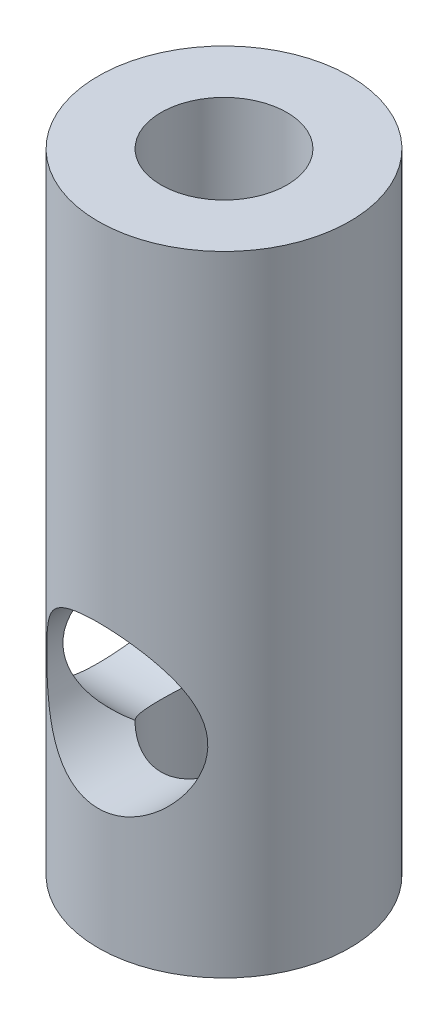
ISO-10303-21;
HEADER;
FILE_DESCRIPTION(('STEP AP214'),'2;1');
FILE_NAME('part.step','',(''),(''),'','','');
FILE_SCHEMA(('AUTOMOTIVE_DESIGN { 1 0 10303 214 1 1 1 1 }'));
ENDSEC;
DATA;
#1=APPLICATION_CONTEXT('core data for automotive mechanical design processes');
#2=APPLICATION_PROTOCOL_DEFINITION('international standard','automotive_design',2000,#1);
#3=PRODUCT_CONTEXT('',#1,'mechanical');
#4=PRODUCT('Part','Part','',(#3));
#5=PRODUCT_RELATED_PRODUCT_CATEGORY('part','',(#4));
#6=PRODUCT_DEFINITION_FORMATION('','',#4);
#7=PRODUCT_DEFINITION_CONTEXT('part definition',#1,'design');
#8=PRODUCT_DEFINITION('design','',#6,#7);
#9=PRODUCT_DEFINITION_SHAPE('','',#8);
#10=(LENGTH_UNIT() NAMED_UNIT(*) SI_UNIT(.MILLI.,.METRE.));
#11=(NAMED_UNIT(*) PLANE_ANGLE_UNIT() SI_UNIT($,.RADIAN.));
#12=(NAMED_UNIT(*) SI_UNIT($,.STERADIAN.) SOLID_ANGLE_UNIT());
#13=UNCERTAINTY_MEASURE_WITH_UNIT(LENGTH_MEASURE(1.E-05),#10,'distance_accuracy_value','');
#14=(GEOMETRIC_REPRESENTATION_CONTEXT(3) GLOBAL_UNCERTAINTY_ASSIGNED_CONTEXT((#13)) GLOBAL_UNIT_ASSIGNED_CONTEXT((#10,
#11,#12)) REPRESENTATION_CONTEXT('',''));
#15=CARTESIAN_POINT('',(0.,0.,0.));
#16=DIRECTION('',(0.,0.,1.));
#17=DIRECTION('',(1.,0.,0.));
#18=AXIS2_PLACEMENT_3D('',#15,#16,#17);
#19=CARTESIAN_POINT('',(0.,15.875,0.));
#20=DIRECTION('',(0.,1.,0.));
#21=DIRECTION('',(0.,0.,1.));
#22=AXIS2_PLACEMENT_3D('',#19,#20,#21);
#23=PLANE('',#22);
#24=CARTESIAN_POINT('',(0.,15.875,0.));
#25=DIRECTION('',(0.,1.,0.));
#26=DIRECTION('',(0.,0.,1.));
#27=AXIS2_PLACEMENT_3D('',#24,#25,#26);
#28=CIRCLE('',#27,3.175);
#29=CARTESIAN_POINT('',(0.,15.875,3.175));
#30=VERTEX_POINT('',#29);
#31=EDGE_CURVE('E130',#30,#30,#28,.T.);
#32=ORIENTED_EDGE('',*,*,#31,.T.);
#33=EDGE_LOOP('',(#32));
#34=FACE_BOUND('',#33,.T.);
#35=CARTESIAN_POINT('',(0.,15.875,0.));
#36=DIRECTION('',(0.,1.,0.));
#37=DIRECTION('',(0.,0.,1.));
#38=AXIS2_PLACEMENT_3D('',#35,#36,#37);
#39=CIRCLE('',#38,1.5875);
#40=CARTESIAN_POINT('',(0.,15.875,1.5875));
#41=VERTEX_POINT('',#40);
#42=EDGE_CURVE('E136',#41,#41,#39,.T.);
#43=ORIENTED_EDGE('',*,*,#42,.F.);
#44=EDGE_LOOP('',(#43));
#45=FACE_BOUND('',#44,.T.);
#46=ADVANCED_FACE('F33',(#34,#45),#23,.T.);
#47=CARTESIAN_POINT('',(0.,0.,0.));
#48=DIRECTION('',(0.,1.,0.));
#49=DIRECTION('',(0.,0.,1.));
#50=AXIS2_PLACEMENT_3D('',#47,#48,#49);
#51=PLANE('',#50);
#52=CARTESIAN_POINT('',(0.,0.,0.));
#53=DIRECTION('',(0.,1.,0.));
#54=DIRECTION('',(0.,0.,1.));
#55=AXIS2_PLACEMENT_3D('',#52,#53,#54);
#56=CIRCLE('',#55,3.175);
#57=CARTESIAN_POINT('',(0.,0.,3.175));
#58=VERTEX_POINT('',#57);
#59=EDGE_CURVE('E132',#58,#58,#56,.T.);
#60=ORIENTED_EDGE('',*,*,#59,.F.);
#61=EDGE_LOOP('',(#60));
#62=FACE_BOUND('',#61,.T.);
#63=CARTESIAN_POINT('',(0.,0.,0.));
#64=DIRECTION('',(0.,1.,0.));
#65=DIRECTION('',(0.,0.,1.));
#66=AXIS2_PLACEMENT_3D('',#63,#64,#65);
#67=CIRCLE('',#66,1.5875);
#68=CARTESIAN_POINT('',(0.,0.,1.5875));
#69=VERTEX_POINT('',#68);
#70=EDGE_CURVE('E138',#69,#69,#67,.T.);
#71=ORIENTED_EDGE('',*,*,#70,.T.);
#72=EDGE_LOOP('',(#71));
#73=FACE_BOUND('',#72,.T.);
#74=ADVANCED_FACE('F150',(#62,#73),#51,.F.);
#75=CARTESIAN_POINT('',(0.,15.875,0.));
#76=DIRECTION('',(0.,-1.,0.));
#77=DIRECTION('',(0.,0.,-1.));
#78=AXIS2_PLACEMENT_3D('',#75,#76,#77);
#79=CYLINDRICAL_SURFACE('',#78,3.175);
#80=CARTESIAN_POINT('',(0.,3.048,3.17500000000001));
#81=CARTESIAN_POINT('',(-0.102802091998536,3.04800863660194,3.17499204317216));
#82=CARTESIAN_POINT('',(-0.205712967083923,3.05585421267752,3.16995556613701));
#83=CARTESIAN_POINT('',(-0.408345945914426,3.08680490395556,3.15028428681525));
#84=CARTESIAN_POINT('',(-0.508062450647387,3.10993542358825,3.13563350529892));
#85=CARTESIAN_POINT('',(-0.700991871551809,3.17007954143306,3.09820061555947));
#86=CARTESIAN_POINT('',(-0.794234443207291,3.20702409197908,3.07545897543814));
#87=CARTESIAN_POINT('',(-0.972850708349801,3.29326197579849,3.02371392471125));
#88=CARTESIAN_POINT('',(-1.05822486510869,3.34255458141424,2.99471088309728));
#89=CARTESIAN_POINT('',(-1.22657617751478,3.45651628498183,2.93000295258297));
#90=CARTESIAN_POINT('',(-1.3087864338533,3.5221131572026,2.89394397085769));
#91=CARTESIAN_POINT('',(-1.46177780864564,3.66466135194346,2.81976531709182));
#92=CARTESIAN_POINT('',(-1.53254282535194,3.74162838446419,2.7816428408765));
#93=CARTESIAN_POINT('',(-1.67097750324059,3.91761552787057,2.70106343805629));
#94=CARTESIAN_POINT('',(-1.73674918752874,4.01821533480986,2.65876858107148));
#95=CARTESIAN_POINT('',(-1.85029508285189,4.23149422021328,2.58104184987293));
#96=CARTESIAN_POINT('',(-1.89810016623101,4.34415214691275,2.5455982543951));
#97=CARTESIAN_POINT('',(-1.96306433169841,4.54753570360518,2.49563815642881));
#98=CARTESIAN_POINT('',(-1.98501258205519,4.63597239510035,2.47805527375042));
#99=CARTESIAN_POINT('',(-2.01688234158148,4.8162613321989,2.45219187814506));
#100=CARTESIAN_POINT('',(-2.02682213142593,4.90810816620397,2.4438972270032));
#101=CARTESIAN_POINT('',(-2.03406844238956,5.09294589348756,2.43787169233308));
#102=CARTESIAN_POINT('',(-2.03133590853695,5.18593944145871,2.44017346588102));
#103=CARTESIAN_POINT('',(-2.01334074881702,5.3698973413432,2.45503753256747));
#104=CARTESIAN_POINT('',(-1.99806778439991,5.46085995533869,2.46760829159313));
#105=CARTESIAN_POINT('',(-1.95654400964381,5.63570188985075,2.50064563775484));
#106=CARTESIAN_POINT('',(-1.93063371932069,5.71971148849693,2.52086589880532));
#107=CARTESIAN_POINT('',(-1.86892073645816,5.88232940711183,2.56695150673926));
#108=CARTESIAN_POINT('',(-1.83311475787165,5.96093592204008,2.5928187282003));
#109=CARTESIAN_POINT('',(-1.74468379478223,6.12668663899968,2.65331736310943));
#110=CARTESIAN_POINT('',(-1.69014547028027,6.21254322496451,2.68867632216135));
#111=CARTESIAN_POINT('',(-1.56927250704523,6.37486083619803,2.76097453557637));
#112=CARTESIAN_POINT('',(-1.50292389187165,6.45131054595402,2.79791562247839));
#113=CARTESIAN_POINT('',(-1.34609593842543,6.60688227372216,2.87709972256473));
#114=CARTESIAN_POINT('',(-1.25342255447501,6.68394982082796,2.91908129280469));
#115=CARTESIAN_POINT('',(-1.05412916945486,6.82139039050818,2.99680453367646));
#116=CARTESIAN_POINT('',(-0.947524248856553,6.88178124815657,3.03255285532205));
#117=CARTESIAN_POINT('',(-0.745027149764204,6.97307479822838,3.08776548970284));
#118=CARTESIAN_POINT('',(-0.65119748908739,7.00744934370647,3.1090528487167));
#119=CARTESIAN_POINT('',(-0.458101923285707,7.06222466387092,3.14330309554202));
#120=CARTESIAN_POINT('',(-0.358840457318056,7.08263667058892,3.15627267398738));
#121=CARTESIAN_POINT('',(-0.157245856062992,7.10846131970164,3.17272053168039));
#122=CARTESIAN_POINT('',(-0.0549035728236089,7.11382366228872,3.1761669816173));
#123=CARTESIAN_POINT('',(0.149278703587838,7.1090803895675,3.17313166741519));
#124=CARTESIAN_POINT('',(0.251118666928858,7.09897386645272,3.16664932059437));
#125=CARTESIAN_POINT('',(0.445777818959483,7.06483170248459,3.14499563248384));
#126=CARTESIAN_POINT('',(0.53878877109895,7.04156495036066,3.13030442711357));
#127=CARTESIAN_POINT('',(0.719347665233581,6.98278346951135,3.09380938215554));
#128=CARTESIAN_POINT('',(0.806894685878689,6.9472666816902,3.07200434684486));
#129=CARTESIAN_POINT('',(0.981221766727702,6.86222429678657,3.02103940447064));
#130=CARTESIAN_POINT('',(1.06746270490707,6.81185465460779,2.99145375338782));
#131=CARTESIAN_POINT('',(1.23068208252938,6.69995479062798,2.92809272901181));
#132=CARTESIAN_POINT('',(1.30765325924851,6.6384159113132,2.89431411212648));
#133=CARTESIAN_POINT('',(1.46249777618802,6.49523243895981,2.81960831865928));
#134=CARTESIAN_POINT('',(1.53871535620922,6.41195269540887,2.77837700931998));
#135=CARTESIAN_POINT('',(1.67667876113209,6.23347215177528,2.69736409760926));
#136=CARTESIAN_POINT('',(1.73842174216537,6.13826901469508,2.65758278141684));
#137=CARTESIAN_POINT('',(1.83860127108378,5.95078432826427,2.58908117678436));
#138=CARTESIAN_POINT('',(1.8790680245676,5.8598752888727,2.5595922960966));
#139=CARTESIAN_POINT('',(1.94668410344128,5.67115232647123,2.50855535607172));
#140=CARTESIAN_POINT('',(1.97385191986361,5.57334820833178,2.48699628145414));
#141=CARTESIAN_POINT('',(2.01355343863444,5.37195108414518,2.45497691549337));
#142=CARTESIAN_POINT('',(2.02594703301666,5.26831226625837,2.44462296914142));
#143=CARTESIAN_POINT('',(2.03456932369406,5.05992252687714,2.43745721220955));
#144=CARTESIAN_POINT('',(2.03080975414351,4.95517246778415,2.44063557133222));
#145=CARTESIAN_POINT('',(2.00920052708876,4.76366310316725,2.45842888308435));
#146=CARTESIAN_POINT('',(1.99345832476194,4.67648564708507,2.47133063315082));
#147=CARTESIAN_POINT('',(1.95129345000782,4.50625826899996,2.50475552346758));
#148=CARTESIAN_POINT('',(1.92486018861994,4.42321253110544,2.52528621816377));
#149=CARTESIAN_POINT('',(1.85150505892117,4.23477250130071,2.5797835060279));
#150=CARTESIAN_POINT('',(1.8006615483089,4.13154152321198,2.61594204524787));
#151=CARTESIAN_POINT('',(1.68340470154152,3.93623992680351,2.69289797773704));
#152=CARTESIAN_POINT('',(1.61697034257884,3.84418463442382,2.73370159586911));
#153=CARTESIAN_POINT('',(1.46896419567042,3.67136733205275,2.81602892763037));
#154=CARTESIAN_POINT('',(1.38722334212311,3.59075109725092,2.85755546234148));
#155=CARTESIAN_POINT('',(1.21025785290111,3.44367896402177,2.93688941547999));
#156=CARTESIAN_POINT('',(1.11503295365482,3.37722334245449,2.97469676118419));
#157=CARTESIAN_POINT('',(0.909208281521375,3.2587798822926,3.04402026615374));
#158=CARTESIAN_POINT('',(0.7982168445794,3.20731739521101,3.07529902946536));
#159=CARTESIAN_POINT('',(0.624671888714869,3.14542196536204,3.11350948741009));
#160=CARTESIAN_POINT('',(0.565696104007337,3.12734803697563,3.1247896026163));
#161=CARTESIAN_POINT('',(0.445862263086738,3.09655673003767,3.14412176120682));
#162=CARTESIAN_POINT('',(0.385005554336112,3.08383560811405,3.1521760603069));
#163=CARTESIAN_POINT('',(0.27023720218778,3.06532637059403,3.16393226692448));
#164=CARTESIAN_POINT('',(0.216481903631269,3.0588398334053,3.1680714141358));
#165=CARTESIAN_POINT('',(0.108494513180765,3.05017432006122,3.17360741161958));
#166=CARTESIAN_POINT('',(0.0542624105331686,3.04799544131028,3.17500419988205));
#167=CARTESIAN_POINT('',(0.,3.048,3.17500000000001));
#168=B_SPLINE_CURVE_WITH_KNOTS('',3,(#80,#81,#82,#83,#84,#85,#86,#87,#88,#89,#90,#91,#92,#93,
#94,#95,#96,#97,#98,#99,#100,#101,#102,#103,#104,#105,#106,#107,#108,#109,#110,#111,#112,#113,
#114,#115,#116,#117,#118,#119,#120,#121,#122,#123,#124,#125,#126,#127,#128,#129,#130,#131,#132,
#133,#134,#135,#136,#137,#138,#139,#140,#141,#142,#143,#144,#145,#146,#147,#148,#149,#150,#151,
#152,#153,#154,#155,#156,#157,#158,#159,#160,#161,#162,#163,#164,#165,#166,#167),.UNSPECIFIED.,
.T.,.F.,(4,2,2,2,2,2,2,2,2,2,2,2,2,2,2,2,2,2,2,2,2,2,2,2,2,2,2,2,2,2,2,2,2,2,2,2,2,2,2,2,2,2,2,
4),(0.,0.308188490220292,0.61689049962424,0.924069691420599,1.23123078573352,1.56350950346237,
1.89625169633383,2.27669378606604,2.6564791333267,2.93374298249309,3.21058421437262,
3.48827921224911,3.76620337686525,4.03584967492173,4.30558562185004,4.62747173688218,
4.94974133945157,5.33077293129879,5.71139543237298,6.01660273138245,6.32156421962704,
6.62754375986629,6.93354125752154,7.22327486627296,7.51305719979868,7.8243458298038,
8.1358767847956,8.49496144237971,8.85411659140031,9.16428665602469,9.47402422204033,
9.78667632231663,10.0991013409219,10.3665263656191,10.6342169126375,10.9941767437131,
11.3546247645709,11.7193179516068,12.0840182682565,12.4602784565965,12.6481152194758,
12.8358204034848,12.9984890022022,13.161161279126),.UNSPECIFIED.);
#169=CARTESIAN_POINT('',(0.,3.048,3.17500000000001));
#170=VERTEX_POINT('',#169);
#171=EDGE_CURVE('E84',#170,#170,#168,.T.);
#172=ORIENTED_EDGE('',*,*,#171,.T.);
#173=EDGE_LOOP('',(#172));
#174=FACE_BOUND('',#173,.T.);
#175=CARTESIAN_POINT('',(-3.175,3.048,0.));
#176=CARTESIAN_POINT('',(-3.17499204317214,3.04800863660194,-0.102802091998547));
#177=CARTESIAN_POINT('',(-3.16995556613701,3.05585421267752,-0.205712967083934));
#178=CARTESIAN_POINT('',(-3.15028428681525,3.08680490395556,-0.408345945914438));
#179=CARTESIAN_POINT('',(-3.13563350529892,3.10993542358825,-0.508062450647399));
#180=CARTESIAN_POINT('',(-3.09820061555947,3.17007954143306,-0.70099187155182));
#181=CARTESIAN_POINT('',(-3.07545897543814,3.20702409197908,-0.794234443207302));
#182=CARTESIAN_POINT('',(-3.02371392471125,3.29326197579849,-0.972850708349811));
#183=CARTESIAN_POINT('',(-2.99471088309727,3.34255458141424,-1.0582248651087));
#184=CARTESIAN_POINT('',(-2.93000295258297,3.45651628498183,-1.22657617751479));
#185=CARTESIAN_POINT('',(-2.89394397085769,3.5221131572026,-1.30878643385331));
#186=CARTESIAN_POINT('',(-2.81976531709181,3.66466135194346,-1.46177780864565));
#187=CARTESIAN_POINT('',(-2.7816428408765,3.74162838446419,-1.53254282535195));
#188=CARTESIAN_POINT('',(-2.70106343805629,3.91761552787057,-1.6709775032406));
#189=CARTESIAN_POINT('',(-2.65876858107147,4.01821533480986,-1.73674918752875));
#190=CARTESIAN_POINT('',(-2.58104184987292,4.23149422021328,-1.8502950828519));
#191=CARTESIAN_POINT('',(-2.5455982543951,4.34415214691275,-1.89810016623102));
#192=CARTESIAN_POINT('',(-2.4956381564288,4.54753570360518,-1.96306433169842));
#193=CARTESIAN_POINT('',(-2.47805527375041,4.63597239510036,-1.9850125820552));
#194=CARTESIAN_POINT('',(-2.45219187814505,4.8162613321989,-2.01688234158149));
#195=CARTESIAN_POINT('',(-2.4438972270032,4.90810816620397,-2.02682213142594));
#196=CARTESIAN_POINT('',(-2.43787169233307,5.09294589348756,-2.03406844238957));
#197=CARTESIAN_POINT('',(-2.44017346588101,5.18593944145871,-2.03133590853695));
#198=CARTESIAN_POINT('',(-2.45503753256747,5.3698973413432,-2.01334074881702));
#199=CARTESIAN_POINT('',(-2.46760829159312,5.46085995533869,-1.99806778439992));
#200=CARTESIAN_POINT('',(-2.50064563775483,5.63570188985075,-1.95654400964382));
#201=CARTESIAN_POINT('',(-2.52086589880531,5.71971148849693,-1.9306337193207));
#202=CARTESIAN_POINT('',(-2.56695150673925,5.88232940711183,-1.86892073645816));
#203=CARTESIAN_POINT('',(-2.59281872820029,5.96093592204008,-1.83311475787166));
#204=CARTESIAN_POINT('',(-2.65331736310943,6.12668663899968,-1.74468379478224));
#205=CARTESIAN_POINT('',(-2.68867632216134,6.21254322496451,-1.69014547028028));
#206=CARTESIAN_POINT('',(-2.76097453557637,6.37486083619803,-1.56927250704524));
#207=CARTESIAN_POINT('',(-2.79791562247838,6.45131054595402,-1.50292389187166));
#208=CARTESIAN_POINT('',(-2.87709972256472,6.60688227372216,-1.34609593842544));
#209=CARTESIAN_POINT('',(-2.91908129280469,6.68394982082796,-1.25342255447502));
#210=CARTESIAN_POINT('',(-2.99680453367646,6.82139039050818,-1.05412916945487));
#211=CARTESIAN_POINT('',(-3.03255285532205,6.88178124815657,-0.947524248856564));
#212=CARTESIAN_POINT('',(-3.08776548970284,6.97307479822838,-0.745027149764215));
#213=CARTESIAN_POINT('',(-3.1090528487167,7.00744934370647,-0.651197489087401));
#214=CARTESIAN_POINT('',(-3.14330309554202,7.06222466387092,-0.458101923285718));
#215=CARTESIAN_POINT('',(-3.15627267398738,7.08263667058892,-0.358840457318067));
#216=CARTESIAN_POINT('',(-3.17272053168039,7.10846131970164,-0.157245856063003));
#217=CARTESIAN_POINT('',(-3.1761669816173,7.11382366228872,-0.0549035728236205));
#218=CARTESIAN_POINT('',(-3.17313166741519,7.1090803895675,0.149278703587826));
#219=CARTESIAN_POINT('',(-3.16664932059437,7.09897386645272,0.251118666928846));
#220=CARTESIAN_POINT('',(-3.14499563248384,7.06483170248459,0.445777818959471));
#221=CARTESIAN_POINT('',(-3.13030442711358,7.04156495036066,0.538788771098939));
#222=CARTESIAN_POINT('',(-3.09380938215554,6.98278346951135,0.71934766523357));
#223=CARTESIAN_POINT('',(-3.07200434684486,6.9472666816902,0.806894685878678));
#224=CARTESIAN_POINT('',(-3.02103940447064,6.86222429678657,0.98122176672769));
#225=CARTESIAN_POINT('',(-2.99145375338782,6.81185465460779,1.06746270490706));
#226=CARTESIAN_POINT('',(-2.92809272901181,6.69995479062798,1.23068208252937));
#227=CARTESIAN_POINT('',(-2.89431411212649,6.6384159113132,1.3076532592485));
#228=CARTESIAN_POINT('',(-2.81960831865929,6.49523243895981,1.46249777618801));
#229=CARTESIAN_POINT('',(-2.77837700931999,6.41195269540887,1.53871535620921));
#230=CARTESIAN_POINT('',(-2.69736409760926,6.23347215177528,1.67667876113208));
#231=CARTESIAN_POINT('',(-2.65758278141685,6.13826901469508,1.73842174216536));
#232=CARTESIAN_POINT('',(-2.58908117678437,5.95078432826427,1.83860127108377));
#233=CARTESIAN_POINT('',(-2.55959229609661,5.8598752888727,1.87906802456759));
#234=CARTESIAN_POINT('',(-2.50855535607173,5.67115232647123,1.94668410344127));
#235=CARTESIAN_POINT('',(-2.48699628145415,5.57334820833178,1.9738519198636));
#236=CARTESIAN_POINT('',(-2.45497691549338,5.37195108414518,2.01355343863443));
#237=CARTESIAN_POINT('',(-2.44462296914143,5.26831226625837,2.02594703301665));
#238=CARTESIAN_POINT('',(-2.43745721220956,5.05992252687714,2.03456932369405));
#239=CARTESIAN_POINT('',(-2.44063557133223,4.95517246778415,2.03080975414351));
#240=CARTESIAN_POINT('',(-2.45842888308435,4.76366310316725,2.00920052708875));
#241=CARTESIAN_POINT('',(-2.47133063315083,4.67648564708507,1.99345832476193));
#242=CARTESIAN_POINT('',(-2.50475552346759,4.50625826899996,1.95129345000781));
#243=CARTESIAN_POINT('',(-2.52528621816378,4.42321253110544,1.92486018861993));
#244=CARTESIAN_POINT('',(-2.5797835060279,4.23477250130071,1.85150505892116));
#245=CARTESIAN_POINT('',(-2.61594204524788,4.13154152321198,1.80066154830889));
#246=CARTESIAN_POINT('',(-2.69289797773704,3.93623992680351,1.68340470154152));
#247=CARTESIAN_POINT('',(-2.73370159586912,3.84418463442382,1.61697034257883));
#248=CARTESIAN_POINT('',(-2.81602892763037,3.67136733205275,1.46896419567041));
#249=CARTESIAN_POINT('',(-2.85755546234148,3.59075109725092,1.3872233421231));
#250=CARTESIAN_POINT('',(-2.93688941547999,3.44367896402177,1.2102578529011));
#251=CARTESIAN_POINT('',(-2.9746967611842,3.37722334245449,1.11503295365481));
#252=CARTESIAN_POINT('',(-3.04402026615375,3.2587798822926,0.909208281521366));
#253=CARTESIAN_POINT('',(-3.07529902946536,3.20731739521101,0.79821684457939));
#254=CARTESIAN_POINT('',(-3.11350948741009,3.14542196536204,0.62467188871486));
#255=CARTESIAN_POINT('',(-3.12478960261631,3.12734803697563,0.565696104007327));
#256=CARTESIAN_POINT('',(-3.14412176120682,3.09655673003767,0.445862263086728));
#257=CARTESIAN_POINT('',(-3.1521760603069,3.08383560811405,0.385005554336102));
#258=CARTESIAN_POINT('',(-3.16393226692449,3.06532637059403,0.270237202187769));
#259=CARTESIAN_POINT('',(-3.16807141413581,3.0588398334053,0.216481903631259));
#260=CARTESIAN_POINT('',(-3.17360741161958,3.05017432006122,0.108494513180754));
#261=CARTESIAN_POINT('',(-3.17500419988204,3.04799544131028,0.0542624105331576));
#262=CARTESIAN_POINT('',(-3.175,3.048,0.));
#263=B_SPLINE_CURVE_WITH_KNOTS('',3,(#175,#176,#177,#178,#179,#180,#181,#182,#183,#184,#185,
#186,#187,#188,#189,#190,#191,#192,#193,#194,#195,#196,#197,#198,#199,#200,#201,#202,#203,#204,
#205,#206,#207,#208,#209,#210,#211,#212,#213,#214,#215,#216,#217,#218,#219,#220,#221,#222,#223,
#224,#225,#226,#227,#228,#229,#230,#231,#232,#233,#234,#235,#236,#237,#238,#239,#240,#241,#242,
#243,#244,#245,#246,#247,#248,#249,#250,#251,#252,#253,#254,#255,#256,#257,#258,#259,#260,#261,
#262),.UNSPECIFIED.,.T.,.F.,(4,2,2,2,2,2,2,2,2,2,2,2,2,2,2,2,2,2,2,2,2,2,2,2,2,2,2,2,2,2,2,2,2,
2,2,2,2,2,2,2,2,2,2,4),(0.,0.308188490220293,0.61689049962424,0.924069691420598,
1.23123078573352,1.56350950346237,1.89625169633383,2.27669378606604,2.6564791333267,
2.93374298249309,3.21058421437262,3.48827921224911,3.76620337686525,4.03584967492173,
4.30558562185004,4.62747173688218,4.94974133945157,5.33077293129879,5.71139543237298,
6.01660273138245,6.32156421962703,6.62754375986629,6.93354125752154,7.22327486627296,
7.51305719979868,7.8243458298038,8.1358767847956,8.49496144237971,8.85411659140031,
9.16428665602469,9.47402422204033,9.78667632231663,10.0991013409219,10.3665263656191,
10.6342169126375,10.9941767437131,11.3546247645709,11.7193179516068,12.0840182682565,
12.4602784565965,12.6481152194758,12.8358204034848,12.9984890022022,13.161161279126),.UNSPECIFIED.);
#264=CARTESIAN_POINT('',(-3.175,3.048,0.));
#265=VERTEX_POINT('',#264);
#266=EDGE_CURVE('E141',#265,#265,#263,.T.);
#267=ORIENTED_EDGE('',*,*,#266,.T.);
#268=EDGE_LOOP('',(#267));
#269=FACE_BOUND('',#268,.T.);
#270=ORIENTED_EDGE('',*,*,#31,.F.);
#271=EDGE_LOOP('',(#270));
#272=FACE_BOUND('',#271,.T.);
#273=ORIENTED_EDGE('',*,*,#59,.T.);
#274=EDGE_LOOP('',(#273));
#275=FACE_BOUND('',#274,.T.);
#276=ADVANCED_FACE('F35',(#174,#269,#272,#275),#79,.T.);
#277=CARTESIAN_POINT('',(0.,15.875,0.));
#278=DIRECTION('',(0.,-1.,0.));
#279=DIRECTION('',(0.,0.,-1.));
#280=AXIS2_PLACEMENT_3D('',#277,#278,#279);
#281=CYLINDRICAL_SURFACE('',#280,1.5875);
#282=CARTESIAN_POINT('',(1.5875,3.81158849342968,0.));
#283=CARTESIAN_POINT('',(1.58751312179172,3.81162344807155,0.0367760406473412));
#284=CARTESIAN_POINT('',(1.58622274471066,3.80998992165695,0.0735265453643812));
#285=CARTESIAN_POINT('',(1.58114457810674,3.80366364133141,0.146494617833782));
#286=CARTESIAN_POINT('',(1.57736341440536,3.7989790041503,0.182713339601895));
#287=CARTESIAN_POINT('',(1.56748745017839,3.78691742602604,0.253793498810657));
#288=CARTESIAN_POINT('',(1.56142849391405,3.77958226094134,0.288667178014696));
#289=CARTESIAN_POINT('',(1.54714229390076,3.76261643441882,0.357407630676259));
#290=CARTESIAN_POINT('',(1.53891349890913,3.75298413120332,0.391273664403262));
#291=CARTESIAN_POINT('',(1.50693158186821,3.71641553616863,0.506502355425604));
#292=CARTESIAN_POINT('',(1.47805956703107,3.68475543348978,0.584984235709854));
#293=CARTESIAN_POINT('',(1.409642315292,3.61565123747314,0.734789786302393));
#294=CARTESIAN_POINT('',(1.37002844259141,3.57817063561295,0.806063231195207));
#295=CARTESIAN_POINT('',(1.27981062032686,3.50052256229498,0.942931249356221));
#296=CARTESIAN_POINT('',(1.22894705816974,3.46031051562292,1.00832930785135));
#297=CARTESIAN_POINT('',(1.11728733416031,3.3813645785163,1.13078481156611));
#298=CARTESIAN_POINT('',(1.05651110871726,3.34262790981225,1.18785857099559));
#299=CARTESIAN_POINT('',(0.928140680132808,3.27092817410777,1.29040634194467));
#300=CARTESIAN_POINT('',(0.860975187654973,3.23778395506232,1.3362861514574));
#301=CARTESIAN_POINT('',(0.718286870731194,3.1776162829444,1.41808426243197));
#302=CARTESIAN_POINT('',(0.642770012450862,3.15058850184078,1.45400961179951));
#303=CARTESIAN_POINT('',(0.496929342236516,3.10847052375384,1.50941397362035));
#304=CARTESIAN_POINT('',(0.427593657749475,3.09218355112661,1.53057279089231));
#305=CARTESIAN_POINT('',(0.285423804791666,3.06685380042514,1.56332945584363));
#306=CARTESIAN_POINT('',(0.212592090574499,3.05780601696596,1.57493390984778));
#307=CARTESIAN_POINT('',(0.0652326860538172,3.04770148331875,1.58788736747203));
#308=CARTESIAN_POINT('',(-0.00929948467029986,3.0466690949459,1.58920510594187));
#309=CARTESIAN_POINT('',(-0.157479756257366,3.05275450688526,1.58141150368115));
#310=CARTESIAN_POINT('',(-0.231127740658478,3.05987336920372,1.57229880399471));
#311=CARTESIAN_POINT('',(-0.37201961208024,3.08113177781517,1.54488725201949));
#312=CARTESIAN_POINT('',(-0.439402320771729,3.09493486571663,1.52702821228378));
#313=CARTESIAN_POINT('',(-0.569938256350407,3.12840060676388,1.48326356793798));
#314=CARTESIAN_POINT('',(-0.633090339103644,3.14806483722942,1.45735579721639));
#315=CARTESIAN_POINT('',(-0.760506229392912,3.19434048242763,1.39546080651173));
#316=CARTESIAN_POINT('',(-0.82421053082819,3.22145981717498,1.35870865694572));
#317=CARTESIAN_POINT('',(-0.944718560463429,3.27971716454814,1.27786390556968));
#318=CARTESIAN_POINT('',(-1.0015187321563,3.31085723147438,1.23376754804385));
#319=CARTESIAN_POINT('',(-1.11881285657647,3.38209081900644,1.12949963384733));
#320=CARTESIAN_POINT('',(-1.17769910470012,3.42271541180886,1.06788359942959));
#321=CARTESIAN_POINT('',(-1.28493971190641,3.50440567854929,0.936121168990963));
#322=CARTESIAN_POINT('',(-1.3332748592356,3.54547201655245,0.865959568804826));
#323=CARTESIAN_POINT('',(-1.41236418382213,3.61825734735961,0.728486165253926));
#324=CARTESIAN_POINT('',(-1.44466754126218,3.65045485732749,0.66232302713818));
#325=CARTESIAN_POINT('',(-1.50027568748081,3.70893709010445,0.524241199336258));
#326=CARTESIAN_POINT('',(-1.52363297726251,3.73525592033068,0.452359175874923));
#327=CARTESIAN_POINT('',(-1.55657869541729,3.77362809367912,0.317810215761029));
#328=CARTESIAN_POINT('',(-1.56797572001817,3.7874725496173,0.256128526436842));
#329=CARTESIAN_POINT('',(-1.57958468002309,3.80173031869851,0.16155040048567));
#330=CARTESIAN_POINT('',(-1.58254081778802,3.80540025863025,0.12946105666885));
#331=CARTESIAN_POINT('',(-1.58650321340078,3.81034033889717,0.0649224461260939));
#332=CARTESIAN_POINT('',(-1.5875059531854,3.81160614930068,0.0324726356702857));
#333=CARTESIAN_POINT('',(-1.5875,3.81158849342966,0.));
#334=B_SPLINE_CURVE_WITH_KNOTS('',3,(#282,#283,#284,#285,#286,#287,#288,#289,#290,#291,#292,
#293,#294,#295,#296,#297,#298,#299,#300,#301,#302,#303,#304,#305,#306,#307,#308,#309,#310,#311,
#312,#313,#314,#315,#316,#317,#318,#319,#320,#321,#322,#323,#324,#325,#326,#327,#328,#329,#330,
#331,#332,#333),.UNSPECIFIED.,.F.,.F.,(4,2,2,2,2,2,2,2,2,2,2,2,2,2,2,2,2,2,2,2,2,2,2,2,2,4),(0.,
0.110228319637525,0.22016459510997,0.328438740774434,0.43679050372958,0.703413832788145,
0.971782635001115,1.24714855331562,1.52196733270886,1.78444545077602,2.04673725279734,
2.26868117455629,2.49047150492691,2.71293567704991,2.9354288367766,3.14773244034195,
3.36009322959749,3.59439904172729,3.82882504426335,4.11104313294338,4.39377088375595,
4.63412835073729,4.87305281280809,5.06477252113693,5.16193522945323,5.25927276629015),.UNSPECIFIED.);
#335=CARTESIAN_POINT('',(1.5875,3.81158849342968,0.));
#336=VERTEX_POINT('',#335);
#337=CARTESIAN_POINT('',(-1.12253201513364,3.38620370911966,1.12253201513365));
#338=VERTEX_POINT('',#337);
#339=EDGE_CURVE('E49',#336,#338,#334,.T.);
#340=ORIENTED_EDGE('',*,*,#339,.F.);
#341=DIRECTION('',(0.,-1.,0.));
#342=VECTOR('',#341,1.);
#343=CARTESIAN_POINT('',(1.5875,15.875,0.));
#344=LINE('',#343,#342);
#345=CARTESIAN_POINT('',(1.5875,6.34841150657032,0.));
#346=VERTEX_POINT('',#345);
#347=EDGE_CURVE('E11',#346,#336,#344,.T.);
#348=ORIENTED_EDGE('',*,*,#347,.F.);
#349=CARTESIAN_POINT('',(-1.5875,6.34841150657032,0.));
#350=CARTESIAN_POINT('',(-1.58751312179172,6.34837655192845,0.0367760406473524));
#351=CARTESIAN_POINT('',(-1.58622274471066,6.35001007834305,0.0735265453643924));
#352=CARTESIAN_POINT('',(-1.58114457810674,6.35633635866859,0.146494617833793));
#353=CARTESIAN_POINT('',(-1.57736341440536,6.3610209958497,0.182713339601906));
#354=CARTESIAN_POINT('',(-1.56748745017839,6.37308257397396,0.253793498810668));
#355=CARTESIAN_POINT('',(-1.56142849391405,6.38041773905866,0.288667178014707));
#356=CARTESIAN_POINT('',(-1.54714229390076,6.39738356558119,0.357407630676269));
#357=CARTESIAN_POINT('',(-1.53891349890912,6.40701586879668,0.391273664403273));
#358=CARTESIAN_POINT('',(-1.50693158186821,6.44358446383137,0.506502355425614));
#359=CARTESIAN_POINT('',(-1.47805956703107,6.47524456651022,0.584984235709864));
#360=CARTESIAN_POINT('',(-1.40964231529199,6.54434876252686,0.734789786302403));
#361=CARTESIAN_POINT('',(-1.3700284425914,6.58182936438705,0.806063231195216));
#362=CARTESIAN_POINT('',(-1.27981062032686,6.65947743770503,0.94293124935623));
#363=CARTESIAN_POINT('',(-1.22894705816973,6.69968948437708,1.00832930785136));
#364=CARTESIAN_POINT('',(-1.11728733416031,6.7786354214837,1.13078481156612));
#365=CARTESIAN_POINT('',(-1.05651110871725,6.81737209018775,1.1878585709956));
#366=CARTESIAN_POINT('',(-0.928140680132799,6.88907182589223,1.29040634194467));
#367=CARTESIAN_POINT('',(-0.860975187654965,6.92221604493768,1.3362861514574));
#368=CARTESIAN_POINT('',(-0.718286870731184,6.9823837170556,1.41808426243198));
#369=CARTESIAN_POINT('',(-0.642770012450852,7.00941149815923,1.45400961179952));
#370=CARTESIAN_POINT('',(-0.496929342236506,7.05152947624616,1.50941397362036));
#371=CARTESIAN_POINT('',(-0.427593657749465,7.06781644887339,1.53057279089231));
#372=CARTESIAN_POINT('',(-0.285423804791656,7.09314619957486,1.56332945584363));
#373=CARTESIAN_POINT('',(-0.212592090574489,7.10219398303404,1.57493390984778));
#374=CARTESIAN_POINT('',(-0.0652326860538067,7.11229851668125,1.58788736747203));
#375=CARTESIAN_POINT('',(0.00929948467031051,7.1133309050541,1.58920510594187));
#376=CARTESIAN_POINT('',(0.157479756257377,7.10724549311474,1.58141150368114));
#377=CARTESIAN_POINT('',(0.231127740658489,7.10012663079628,1.57229880399471));
#378=CARTESIAN_POINT('',(0.37201961208025,7.07886822218483,1.54488725201949));
#379=CARTESIAN_POINT('',(0.439402320771739,7.06506513428337,1.52702821228378));
#380=CARTESIAN_POINT('',(0.569938256350416,7.03159939323612,1.48326356793797));
#381=CARTESIAN_POINT('',(0.633090339103654,7.01193516277058,1.45735579721638));
#382=CARTESIAN_POINT('',(0.760506229392921,6.96565951757237,1.39546080651173));
#383=CARTESIAN_POINT('',(0.824210530828199,6.93854018282502,1.35870865694571));
#384=CARTESIAN_POINT('',(0.944718560463437,6.88028283545186,1.27786390556968));
#385=CARTESIAN_POINT('',(1.0015187321563,6.84914276852562,1.23376754804384));
#386=CARTESIAN_POINT('',(1.11881285657648,6.77790918099356,1.12949963384733));
#387=CARTESIAN_POINT('',(1.17769910470013,6.73728458819114,1.06788359942958));
#388=CARTESIAN_POINT('',(1.28493971190642,6.65559432145071,0.936121168990955));
#389=CARTESIAN_POINT('',(1.3332748592356,6.61452798344756,0.865959568804817));
#390=CARTESIAN_POINT('',(1.41236418382213,6.5417426526404,0.728486165253916));
#391=CARTESIAN_POINT('',(1.44466754126219,6.50954514267251,0.66232302713817));
#392=CARTESIAN_POINT('',(1.50027568748081,6.45106290989555,0.524241199336249));
#393=CARTESIAN_POINT('',(1.52363297726252,6.42474407966932,0.452359175874913));
#394=CARTESIAN_POINT('',(1.55657869541729,6.38637190632089,0.317810215761019));
#395=CARTESIAN_POINT('',(1.56797572001817,6.37252745038271,0.256128526436832));
#396=CARTESIAN_POINT('',(1.57958468002309,6.35826968130149,0.16155040048566));
#397=CARTESIAN_POINT('',(1.58254081778802,6.35459974136975,0.129461056668839));
#398=CARTESIAN_POINT('',(1.58650321340078,6.34965966110283,0.064922446126083));
#399=CARTESIAN_POINT('',(1.5875059531854,6.34839385069932,0.0324726356702748));
#400=CARTESIAN_POINT('',(1.5875,6.34841150657034,0.));
#401=B_SPLINE_CURVE_WITH_KNOTS('',3,(#349,#350,#351,#352,#353,#354,#355,#356,#357,#358,#359,
#360,#361,#362,#363,#364,#365,#366,#367,#368,#369,#370,#371,#372,#373,#374,#375,#376,#377,#378,
#379,#380,#381,#382,#383,#384,#385,#386,#387,#388,#389,#390,#391,#392,#393,#394,#395,#396,#397,
#398,#399,#400),.UNSPECIFIED.,.F.,.F.,(4,2,2,2,2,2,2,2,2,2,2,2,2,2,2,2,2,2,2,2,2,2,2,2,2,4),(0.,
0.110228319637525,0.22016459510997,0.328438740774434,0.43679050372958,0.703413832788145,
0.971782635001114,1.24714855331562,1.52196733270886,1.78444545077602,2.04673725279734,
2.26868117455629,2.49047150492691,2.71293567704991,2.9354288367766,3.14773244034195,
3.36009322959749,3.59439904172729,3.82882504426335,4.11104313294338,4.39377088375595,
4.63412835073729,4.87305281280809,5.06477252113693,5.16193522945323,5.25927276629015),.UNSPECIFIED.);
#402=CARTESIAN_POINT('',(-1.12253201513364,6.77379629088034,1.12253201513365));
#403=VERTEX_POINT('',#402);
#404=EDGE_CURVE('E68',#403,#346,#401,.T.);
#405=ORIENTED_EDGE('',*,*,#404,.F.);
#406=CARTESIAN_POINT('',(0.,6.34841150657032,-1.5875));
#407=CARTESIAN_POINT('',(-0.0367760406473459,6.34837655192845,-1.58751312179172));
#408=CARTESIAN_POINT('',(-0.0735265453643858,6.35001007834305,-1.58622274471066));
#409=CARTESIAN_POINT('',(-0.146494617833787,6.35633635866859,-1.58114457810674));
#410=CARTESIAN_POINT('',(-0.1827133396019,6.3610209958497,-1.57736341440536));
#411=CARTESIAN_POINT('',(-0.253793498810661,6.37308257397396,-1.56748745017839));
#412=CARTESIAN_POINT('',(-0.2886671780147,6.38041773905866,-1.56142849391405));
#413=CARTESIAN_POINT('',(-0.357407630676263,6.39738356558119,-1.54714229390076));
#414=CARTESIAN_POINT('',(-0.391273664403266,6.40701586879668,-1.53891349890913));
#415=CARTESIAN_POINT('',(-0.506502355425607,6.44358446383137,-1.50693158186821));
#416=CARTESIAN_POINT('',(-0.584984235709857,6.47524456651022,-1.47805956703107));
#417=CARTESIAN_POINT('',(-0.734789786302396,6.54434876252686,-1.409642315292));
#418=CARTESIAN_POINT('',(-0.806063231195209,6.58182936438705,-1.37002844259141));
#419=CARTESIAN_POINT('',(-0.942931249356223,6.65947743770502,-1.27981062032686));
#420=CARTESIAN_POINT('',(-1.00832930785136,6.69968948437708,-1.22894705816974));
#421=CARTESIAN_POINT('',(-1.13078481156612,6.7786354214837,-1.11728733416031));
#422=CARTESIAN_POINT('',(-1.18785857099559,6.81737209018775,-1.05651110871726));
#423=CARTESIAN_POINT('',(-1.29040634194467,6.88907182589223,-0.928140680132806));
#424=CARTESIAN_POINT('',(-1.3362861514574,6.92221604493768,-0.860975187654972));
#425=CARTESIAN_POINT('',(-1.41808426243198,6.9823837170556,-0.718286870731192));
#426=CARTESIAN_POINT('',(-1.45400961179951,7.00941149815923,-0.64277001245086));
#427=CARTESIAN_POINT('',(-1.50941397362035,7.05152947624616,-0.496929342236514));
#428=CARTESIAN_POINT('',(-1.53057279089231,7.06781644887339,-0.427593657749473));
#429=CARTESIAN_POINT('',(-1.56332945584363,7.09314619957485,-0.285423804791664));
#430=CARTESIAN_POINT('',(-1.57493390984778,7.10219398303404,-0.212592090574497));
#431=CARTESIAN_POINT('',(-1.58788736747203,7.11229851668125,-0.0652326860538144));
#432=CARTESIAN_POINT('',(-1.58920510594187,7.1133309050541,0.00929948467030281));
#433=CARTESIAN_POINT('',(-1.58141150368115,7.10724549311474,0.157479756257369));
#434=CARTESIAN_POINT('',(-1.57229880399471,7.10012663079628,0.231127740658481));
#435=CARTESIAN_POINT('',(-1.54488725201949,7.07886822218484,0.372019612080242));
#436=CARTESIAN_POINT('',(-1.52702821228378,7.06506513428337,0.439402320771732));
#437=CARTESIAN_POINT('',(-1.48326356793798,7.03159939323612,0.569938256350409));
#438=CARTESIAN_POINT('',(-1.45735579721639,7.01193516277058,0.633090339103647));
#439=CARTESIAN_POINT('',(-1.39546080651173,6.96565951757237,0.760506229392914));
#440=CARTESIAN_POINT('',(-1.35870865694572,6.93854018282502,0.824210530828192));
#441=CARTESIAN_POINT('',(-1.27786390556968,6.88028283545186,0.94471856046343));
#442=CARTESIAN_POINT('',(-1.23376754804385,6.84914276852562,1.0015187321563));
#443=CARTESIAN_POINT('',(-1.12949963384733,6.77790918099356,1.11881285657648));
#444=CARTESIAN_POINT('',(-1.06788359942958,6.73728458819115,1.17769910470012));
#445=CARTESIAN_POINT('',(-0.936121168990962,6.65559432145072,1.28493971190641));
#446=CARTESIAN_POINT('',(-0.865959568804825,6.61452798344756,1.3332748592356));
#447=CARTESIAN_POINT('',(-0.728486165253924,6.5417426526404,1.41236418382213));
#448=CARTESIAN_POINT('',(-0.662323027138178,6.50954514267251,1.44466754126218));
#449=CARTESIAN_POINT('',(-0.524241199336256,6.45106290989556,1.50027568748081));
#450=CARTESIAN_POINT('',(-0.45235917587492,6.42474407966932,1.52363297726251));
#451=CARTESIAN_POINT('',(-0.317810215761026,6.38637190632089,1.55657869541729));
#452=CARTESIAN_POINT('',(-0.256128526436838,6.37252745038271,1.56797572001817));
#453=CARTESIAN_POINT('',(-0.161550400485665,6.3582696813015,1.57958468002309));
#454=CARTESIAN_POINT('',(-0.129461056668845,6.35459974136975,1.58254081778802));
#455=CARTESIAN_POINT('',(-0.0649224461260882,6.34965966110283,1.58650321340078));
#456=CARTESIAN_POINT('',(-0.0324726356702797,6.34839385069932,1.5875059531854));
#457=CARTESIAN_POINT('',(0.,6.34841150657034,1.5875));
#458=B_SPLINE_CURVE_WITH_KNOTS('',3,(#406,#407,#408,#409,#410,#411,#412,#413,#414,#415,#416,
#417,#418,#419,#420,#421,#422,#423,#424,#425,#426,#427,#428,#429,#430,#431,#432,#433,#434,#435,
#436,#437,#438,#439,#440,#441,#442,#443,#444,#445,#446,#447,#448,#449,#450,#451,#452,#453,#454,
#455,#456,#457),.UNSPECIFIED.,.F.,.F.,(4,2,2,2,2,2,2,2,2,2,2,2,2,2,2,2,2,2,2,2,2,2,2,2,2,4),(0.,
0.110228319637525,0.22016459510997,0.328438740774434,0.436790503729579,0.703413832788143,
0.971782635001113,1.24714855331562,1.52196733270886,1.78444545077601,2.04673725279734,
2.26868117455629,2.49047150492691,2.71293567704991,2.93542883677659,3.14773244034195,
3.36009322959748,3.59439904172729,3.82882504426335,4.11104313294338,4.39377088375594,
4.63412835073729,4.87305281280809,5.06477252113694,5.16193522945323,5.25927276629016),.UNSPECIFIED.);
#459=CARTESIAN_POINT('',(0.,6.34841150657032,-1.5875));
#460=VERTEX_POINT('',#459);
#461=EDGE_CURVE('E118',#460,#403,#458,.T.);
#462=ORIENTED_EDGE('',*,*,#461,.F.);
#463=DIRECTION('',(0.,-1.,0.));
#464=VECTOR('',#463,1.);
#465=CARTESIAN_POINT('',(0.,15.875,-1.5875));
#466=LINE('',#465,#464);
#467=CARTESIAN_POINT('',(0.,3.81158849342968,-1.5875));
#468=VERTEX_POINT('',#467);
#469=EDGE_CURVE('E129',#468,#460,#466,.F.);
#470=ORIENTED_EDGE('',*,*,#469,.F.);
#471=CARTESIAN_POINT('',(0.,3.81158849342968,1.5875));
#472=CARTESIAN_POINT('',(-0.0367760406473459,3.81162344807155,1.58751312179172));
#473=CARTESIAN_POINT('',(-0.0735265453643859,3.80998992165695,1.58622274471066));
#474=CARTESIAN_POINT('',(-0.146494617833787,3.80366364133141,1.58114457810674));
#475=CARTESIAN_POINT('',(-0.1827133396019,3.7989790041503,1.57736341440536));
#476=CARTESIAN_POINT('',(-0.253793498810661,3.78691742602604,1.56748745017839));
#477=CARTESIAN_POINT('',(-0.2886671780147,3.77958226094134,1.56142849391405));
#478=CARTESIAN_POINT('',(-0.357407630676263,3.76261643441882,1.54714229390076));
#479=CARTESIAN_POINT('',(-0.391273664403266,3.75298413120332,1.53891349890913));
#480=CARTESIAN_POINT('',(-0.506502355425607,3.71641553616863,1.50693158186821));
#481=CARTESIAN_POINT('',(-0.584984235709858,3.68475543348978,1.47805956703107));
#482=CARTESIAN_POINT('',(-0.734789786302397,3.61565123747314,1.409642315292));
#483=CARTESIAN_POINT('',(-0.80606323119521,3.57817063561295,1.37002844259141));
#484=CARTESIAN_POINT('',(-0.942931249356223,3.50052256229498,1.27981062032686));
#485=CARTESIAN_POINT('',(-1.00832930785136,3.46031051562292,1.22894705816974));
#486=CARTESIAN_POINT('',(-1.13078481156611,3.3813645785163,1.11728733416031));
#487=CARTESIAN_POINT('',(-1.18785857099559,3.34262790981225,1.05651110871726));
#488=CARTESIAN_POINT('',(-1.29040634194467,3.27092817410777,0.928140680132806));
#489=CARTESIAN_POINT('',(-1.3362861514574,3.23778395506233,0.860975187654972));
#490=CARTESIAN_POINT('',(-1.41808426243198,3.1776162829444,0.718286870731192));
#491=CARTESIAN_POINT('',(-1.45400961179951,3.15058850184078,0.64277001245086));
#492=CARTESIAN_POINT('',(-1.50941397362035,3.10847052375384,0.496929342236514));
#493=CARTESIAN_POINT('',(-1.53057279089231,3.09218355112661,0.427593657749472));
#494=CARTESIAN_POINT('',(-1.56332945584363,3.06685380042515,0.285423804791663));
#495=CARTESIAN_POINT('',(-1.57493390984778,3.05780601696596,0.212592090574496));
#496=CARTESIAN_POINT('',(-1.58788736747203,3.04770148331875,0.065232686053814));
#497=CARTESIAN_POINT('',(-1.58920510594187,3.0466690949459,-0.00929948467030327));
#498=CARTESIAN_POINT('',(-1.58141150368115,3.05275450688526,-0.15747975625737));
#499=CARTESIAN_POINT('',(-1.57229880399471,3.05987336920372,-0.231127740658481));
#500=CARTESIAN_POINT('',(-1.54488725201949,3.08113177781516,-0.372019612080243));
#501=CARTESIAN_POINT('',(-1.52702821228378,3.09493486571663,-0.439402320771732));
#502=CARTESIAN_POINT('',(-1.48326356793798,3.12840060676388,-0.56993825635041));
#503=CARTESIAN_POINT('',(-1.45735579721638,3.14806483722942,-0.633090339103647));
#504=CARTESIAN_POINT('',(-1.39546080651173,3.19434048242763,-0.760506229392915));
#505=CARTESIAN_POINT('',(-1.35870865694572,3.22145981717498,-0.824210530828193));
#506=CARTESIAN_POINT('',(-1.27786390556968,3.27971716454814,-0.944718560463431));
#507=CARTESIAN_POINT('',(-1.23376754804384,3.31085723147438,-1.0015187321563));
#508=CARTESIAN_POINT('',(-1.12949963384733,3.38209081900644,-1.11881285657648));
#509=CARTESIAN_POINT('',(-1.06788359942958,3.42271541180885,-1.17769910470012));
#510=CARTESIAN_POINT('',(-0.936121168990961,3.50440567854929,-1.28493971190641));
#511=CARTESIAN_POINT('',(-0.865959568804824,3.54547201655244,-1.3332748592356));
#512=CARTESIAN_POINT('',(-0.728486165253924,3.6182573473596,-1.41236418382213));
#513=CARTESIAN_POINT('',(-0.662323027138177,3.65045485732749,-1.44466754126218));
#514=CARTESIAN_POINT('',(-0.524241199336256,3.70893709010444,-1.50027568748081));
#515=CARTESIAN_POINT('',(-0.45235917587492,3.73525592033068,-1.52363297726251));
#516=CARTESIAN_POINT('',(-0.317810215761026,3.77362809367912,-1.55657869541729));
#517=CARTESIAN_POINT('',(-0.256128526436838,3.7874725496173,-1.56797572001817));
#518=CARTESIAN_POINT('',(-0.161550400485666,3.80173031869851,-1.57958468002309));
#519=CARTESIAN_POINT('',(-0.129461056668845,3.80540025863025,-1.58254081778802));
#520=CARTESIAN_POINT('',(-0.064922446126088,3.81034033889717,-1.58650321340078));
#521=CARTESIAN_POINT('',(-0.0324726356702796,3.81160614930068,-1.5875059531854));
#522=CARTESIAN_POINT('',(0.,3.81158849342966,-1.5875));
#523=B_SPLINE_CURVE_WITH_KNOTS('',3,(#471,#472,#473,#474,#475,#476,#477,#478,#479,#480,#481,
#482,#483,#484,#485,#486,#487,#488,#489,#490,#491,#492,#493,#494,#495,#496,#497,#498,#499,#500,
#501,#502,#503,#504,#505,#506,#507,#508,#509,#510,#511,#512,#513,#514,#515,#516,#517,#518,#519,
#520,#521,#522),.UNSPECIFIED.,.F.,.F.,(4,2,2,2,2,2,2,2,2,2,2,2,2,2,2,2,2,2,2,2,2,2,2,2,2,4),(0.,
0.110228319637525,0.22016459510997,0.328438740774434,0.436790503729579,0.703413832788144,
0.971782635001113,1.24714855331562,1.52196733270886,1.78444545077601,2.04673725279734,
2.26868117455629,2.49047150492691,2.71293567704991,2.9354288367766,3.14773244034195,
3.36009322959749,3.59439904172729,3.82882504426335,4.11104313294338,4.39377088375594,
4.63412835073729,4.87305281280809,5.06477252113694,5.16193522945323,5.25927276629016),.UNSPECIFIED.);
#524=EDGE_CURVE('E56',#338,#468,#523,.T.);
#525=ORIENTED_EDGE('',*,*,#524,.F.);
#526=EDGE_LOOP('',(#340,#348,#405,#462,#470,#525));
#527=FACE_BOUND('',#526,.T.);
#528=ORIENTED_EDGE('',*,*,#42,.T.);
#529=EDGE_LOOP('',(#528));
#530=FACE_BOUND('',#529,.T.);
#531=ORIENTED_EDGE('',*,*,#70,.F.);
#532=EDGE_LOOP('',(#531));
#533=FACE_BOUND('',#532,.T.);
#534=ADVANCED_FACE('F81',(#527,#530,#533),#281,.F.);
#535=CARTESIAN_POINT('',(-3.175,5.08,0.));
#536=DIRECTION('',(1.,0.,0.));
#537=DIRECTION('',(0.,0.,-1.));
#538=AXIS2_PLACEMENT_3D('',#535,#536,#537);
#539=CYLINDRICAL_SURFACE('',#538,2.032);
#540=ORIENTED_EDGE('',*,*,#461,.T.);
#541=CARTESIAN_POINT('',(0.,5.08,0.));
#542=DIRECTION('',(0.707106781186549,0.,0.707106781186546));
#543=DIRECTION('',(0.707106781186546,0.,-0.707106781186549));
#544=AXIS2_PLACEMENT_3D('',#541,#542,#543);
#545=ELLIPSE('',#544,2.87368195874212,2.032);
#546=EDGE_CURVE('E42',#403,#338,#545,.T.);
#547=ORIENTED_EDGE('',*,*,#546,.T.);
#548=ORIENTED_EDGE('',*,*,#524,.T.);
#549=CARTESIAN_POINT('',(0.,5.08,0.));
#550=DIRECTION('',(1.,0.,0.));
#551=DIRECTION('',(0.,0.,-1.));
#552=AXIS2_PLACEMENT_3D('',#549,#550,#551);
#553=CIRCLE('',#552,2.032);
#554=EDGE_CURVE('E87',#468,#460,#553,.T.);
#555=ORIENTED_EDGE('',*,*,#554,.T.);
#556=EDGE_LOOP('',(#540,#547,#548,#555));
#557=FACE_BOUND('',#556,.T.);
#558=ORIENTED_EDGE('',*,*,#266,.F.);
#559=EDGE_LOOP('',(#558));
#560=FACE_BOUND('',#559,.T.);
#561=ADVANCED_FACE('F111',(#557,#560),#539,.F.);
#562=CARTESIAN_POINT('',(0.,5.08,0.));
#563=DIRECTION('',(1.,0.,0.));
#564=DIRECTION('',(0.,0.,-1.));
#565=AXIS2_PLACEMENT_3D('',#562,#563,#564);
#566=PLANE('',#565);
#567=ORIENTED_EDGE('',*,*,#469,.T.);
#568=ORIENTED_EDGE('',*,*,#554,.F.);
#569=EDGE_LOOP('',(#567,#568));
#570=FACE_BOUND('',#569,.T.);
#571=ADVANCED_FACE('F107',(#570),#566,.F.);
#572=CARTESIAN_POINT('',(0.,5.08,3.17500000000001));
#573=DIRECTION('',(0.,0.,-1.));
#574=DIRECTION('',(-1.,0.,0.));
#575=AXIS2_PLACEMENT_3D('',#572,#573,#574);
#576=CYLINDRICAL_SURFACE('',#575,2.032);
#577=ORIENTED_EDGE('',*,*,#339,.T.);
#578=ORIENTED_EDGE('',*,*,#546,.F.);
#579=ORIENTED_EDGE('',*,*,#404,.T.);
#580=CARTESIAN_POINT('',(0.,5.08,0.));
#581=DIRECTION('',(0.,0.,-1.));
#582=DIRECTION('',(-1.,0.,0.));
#583=AXIS2_PLACEMENT_3D('',#580,#581,#582);
#584=CIRCLE('',#583,2.032);
#585=EDGE_CURVE('E72',#346,#336,#584,.T.);
#586=ORIENTED_EDGE('',*,*,#585,.T.);
#587=EDGE_LOOP('',(#577,#578,#579,#586));
#588=FACE_BOUND('',#587,.T.);
#589=ORIENTED_EDGE('',*,*,#171,.F.);
#590=EDGE_LOOP('',(#589));
#591=FACE_BOUND('',#590,.T.);
#592=ADVANCED_FACE('F70',(#588,#591),#576,.F.);
#593=CARTESIAN_POINT('',(0.,5.08,0.));
#594=DIRECTION('',(0.,0.,-1.));
#595=DIRECTION('',(-1.,0.,0.));
#596=AXIS2_PLACEMENT_3D('',#593,#594,#595);
#597=PLANE('',#596);
#598=ORIENTED_EDGE('',*,*,#347,.T.);
#599=ORIENTED_EDGE('',*,*,#585,.F.);
#600=EDGE_LOOP('',(#598,#599));
#601=FACE_BOUND('',#600,.T.);
#602=ADVANCED_FACE('F79',(#601),#597,.F.);
#603=CLOSED_SHELL('',(#46,#74,#276,#534,#561,#571,#592,#602));
#604=MANIFOLD_SOLID_BREP('B2',#603);
#605=ADVANCED_BREP_SHAPE_REPRESENTATION('',(#18,#604),#14);
#606=SHAPE_DEFINITION_REPRESENTATION(#9,#605);
ENDSEC;
END-ISO-10303-21;
